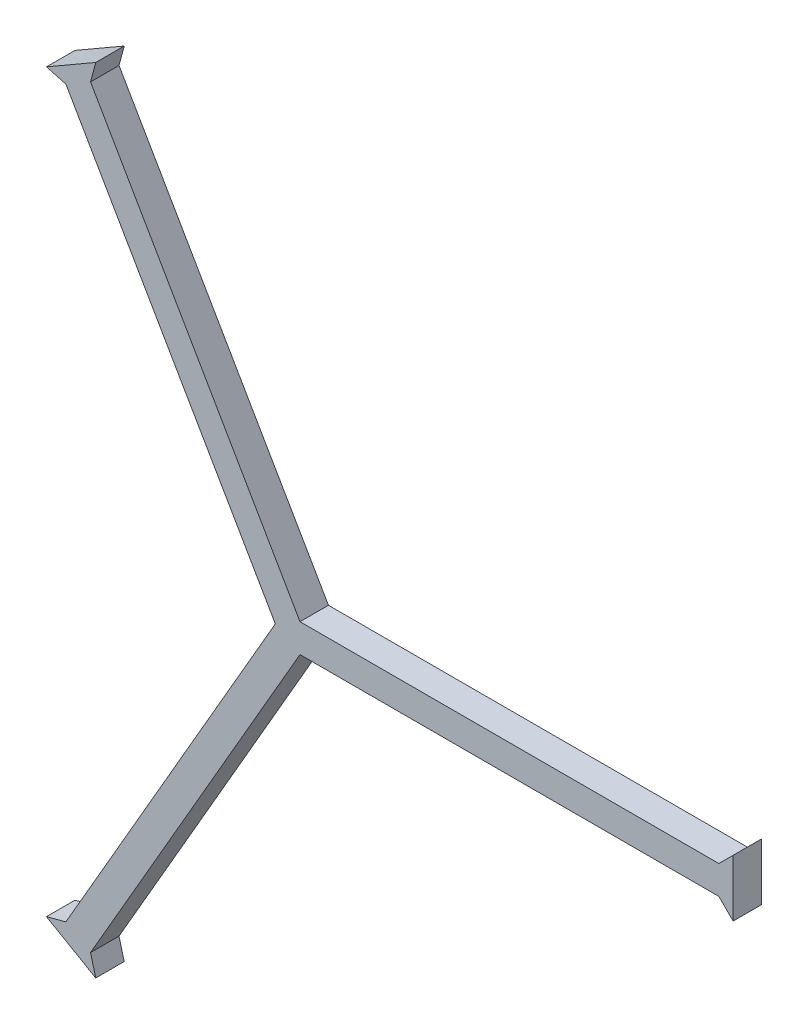
ISO-10303-21;
HEADER;
FILE_DESCRIPTION(('STEP AP214'),'2;1');
FILE_NAME('part.step','',(''),(''),'','','');
FILE_SCHEMA(('AUTOMOTIVE_DESIGN { 1 0 10303 214 1 1 1 1 }'));
ENDSEC;
DATA;
#1=APPLICATION_CONTEXT('core data for automotive mechanical design processes');
#2=APPLICATION_PROTOCOL_DEFINITION('international standard','automotive_design',2000,#1);
#3=PRODUCT_CONTEXT('',#1,'mechanical');
#4=PRODUCT('Part','Part','',(#3));
#5=PRODUCT_RELATED_PRODUCT_CATEGORY('part','',(#4));
#6=PRODUCT_DEFINITION_FORMATION('','',#4);
#7=PRODUCT_DEFINITION_CONTEXT('part definition',#1,'design');
#8=PRODUCT_DEFINITION('design','',#6,#7);
#9=PRODUCT_DEFINITION_SHAPE('','',#8);
#10=(LENGTH_UNIT() NAMED_UNIT(*) SI_UNIT(.MILLI.,.METRE.));
#11=(NAMED_UNIT(*) PLANE_ANGLE_UNIT() SI_UNIT($,.RADIAN.));
#12=(NAMED_UNIT(*) SI_UNIT($,.STERADIAN.) SOLID_ANGLE_UNIT());
#13=UNCERTAINTY_MEASURE_WITH_UNIT(LENGTH_MEASURE(1.E-05),#10,'distance_accuracy_value','');
#14=(GEOMETRIC_REPRESENTATION_CONTEXT(3) GLOBAL_UNCERTAINTY_ASSIGNED_CONTEXT((#13)) GLOBAL_UNIT_ASSIGNED_CONTEXT((#10,
#11,#12)) REPRESENTATION_CONTEXT('',''));
#15=CARTESIAN_POINT('',(0.,0.,0.));
#16=DIRECTION('',(0.,0.,1.));
#17=DIRECTION('',(1.,0.,0.));
#18=AXIS2_PLACEMENT_3D('',#15,#16,#17);
#19=CARTESIAN_POINT('',(150.,5.,10.));
#20=DIRECTION('',(0.,-1.,0.));
#21=DIRECTION('',(1.,0.,0.));
#22=AXIS2_PLACEMENT_3D('',#19,#20,#21);
#23=PLANE('',#22);
#24=DIRECTION('',(0.,0.,-1.));
#25=VECTOR('',#24,1.);
#26=CARTESIAN_POINT('',(2.88675134594807,4.99999999999998,10.));
#27=LINE('',#26,#25);
#28=CARTESIAN_POINT('',(2.88675134594814,4.99999999999998,10.));
#29=VERTEX_POINT('',#28);
#30=CARTESIAN_POINT('',(2.88675134594814,4.99999999999998,0.));
#31=VERTEX_POINT('',#30);
#32=EDGE_CURVE('E48',#29,#31,#27,.T.);
#33=ORIENTED_EDGE('',*,*,#32,.F.);
#34=DIRECTION('',(-1.,0.,0.));
#35=VECTOR('',#34,1.);
#36=CARTESIAN_POINT('',(150.,5.,10.));
#37=LINE('',#36,#35);
#38=CARTESIAN_POINT('',(150.,5.,10.));
#39=VERTEX_POINT('',#38);
#40=EDGE_CURVE('E220',#39,#29,#37,.T.);
#41=ORIENTED_EDGE('',*,*,#40,.F.);
#42=DIRECTION('',(0.,0.,-1.));
#43=VECTOR('',#42,1.);
#44=CARTESIAN_POINT('',(150.,5.,10.));
#45=LINE('',#44,#43);
#46=CARTESIAN_POINT('',(150.,5.,0.));
#47=VERTEX_POINT('',#46);
#48=EDGE_CURVE('E41',#39,#47,#45,.T.);
#49=ORIENTED_EDGE('',*,*,#48,.T.);
#50=DIRECTION('',(-1.,0.,0.));
#51=VECTOR('',#50,1.);
#52=CARTESIAN_POINT('',(150.,5.,0.));
#53=LINE('',#52,#51);
#54=EDGE_CURVE('E53',#47,#31,#53,.T.);
#55=ORIENTED_EDGE('',*,*,#54,.T.);
#56=EDGE_LOOP('',(#33,#41,#49,#55));
#57=FACE_BOUND('',#56,.T.);
#58=ADVANCED_FACE('F33',(#57),#23,.F.);
#59=CARTESIAN_POINT('',(150.,-5.,10.));
#60=DIRECTION('',(0.,1.,0.));
#61=DIRECTION('',(-1.,0.,0.));
#62=AXIS2_PLACEMENT_3D('',#59,#60,#61);
#63=PLANE('',#62);
#64=DIRECTION('',(0.,0.,1.));
#65=VECTOR('',#64,1.);
#66=CARTESIAN_POINT('',(2.88675134594815,-4.99999999999998,10.));
#67=LINE('',#66,#65);
#68=CARTESIAN_POINT('',(2.88675134594815,-4.99999999999998,0.));
#69=VERTEX_POINT('',#68);
#70=CARTESIAN_POINT('',(2.88675134594814,-4.99999999999998,10.));
#71=VERTEX_POINT('',#70);
#72=EDGE_CURVE('E209',#69,#71,#67,.T.);
#73=ORIENTED_EDGE('',*,*,#72,.F.);
#74=DIRECTION('',(1.,0.,0.));
#75=VECTOR('',#74,1.);
#76=CARTESIAN_POINT('',(150.,-5.,0.));
#77=LINE('',#76,#75);
#78=CARTESIAN_POINT('',(150.,-5.,0.));
#79=VERTEX_POINT('',#78);
#80=EDGE_CURVE('E232',#69,#79,#77,.T.);
#81=ORIENTED_EDGE('',*,*,#80,.T.);
#82=DIRECTION('',(0.,0.,-1.));
#83=VECTOR('',#82,1.);
#84=CARTESIAN_POINT('',(150.,-5.,10.));
#85=LINE('',#84,#83);
#86=CARTESIAN_POINT('',(150.,-5.,10.));
#87=VERTEX_POINT('',#86);
#88=EDGE_CURVE('E237',#87,#79,#85,.T.);
#89=ORIENTED_EDGE('',*,*,#88,.F.);
#90=DIRECTION('',(1.,0.,0.));
#91=VECTOR('',#90,1.);
#92=CARTESIAN_POINT('',(150.,-5.,10.));
#93=LINE('',#92,#91);
#94=EDGE_CURVE('E222',#71,#87,#93,.T.);
#95=ORIENTED_EDGE('',*,*,#94,.F.);
#96=EDGE_LOOP('',(#73,#81,#89,#95));
#97=FACE_BOUND('',#96,.T.);
#98=ADVANCED_FACE('F271',(#97),#63,.F.);
#99=CARTESIAN_POINT('',(155.,10.,10.));
#100=DIRECTION('',(-1.,0.,0.));
#101=DIRECTION('',(0.,0.,1.));
#102=AXIS2_PLACEMENT_3D('',#99,#100,#101);
#103=PLANE('',#102);
#104=DIRECTION('',(0.,1.,0.));
#105=VECTOR('',#104,1.);
#106=CARTESIAN_POINT('',(155.,10.,0.));
#107=LINE('',#106,#105);
#108=CARTESIAN_POINT('',(155.,-10.,0.));
#109=VERTEX_POINT('',#108);
#110=CARTESIAN_POINT('',(155.,10.,0.));
#111=VERTEX_POINT('',#110);
#112=EDGE_CURVE('E213',#109,#111,#107,.T.);
#113=ORIENTED_EDGE('',*,*,#112,.T.);
#114=DIRECTION('',(0.,0.,-1.));
#115=VECTOR('',#114,1.);
#116=CARTESIAN_POINT('',(155.,10.,10.));
#117=LINE('',#116,#115);
#118=CARTESIAN_POINT('',(155.,10.,10.));
#119=VERTEX_POINT('',#118);
#120=EDGE_CURVE('E11',#119,#111,#117,.T.);
#121=ORIENTED_EDGE('',*,*,#120,.F.);
#122=DIRECTION('',(0.,1.,0.));
#123=VECTOR('',#122,1.);
#124=CARTESIAN_POINT('',(155.,10.,10.));
#125=LINE('',#124,#123);
#126=CARTESIAN_POINT('',(155.,-10.,10.));
#127=VERTEX_POINT('',#126);
#128=EDGE_CURVE('E214',#127,#119,#125,.T.);
#129=ORIENTED_EDGE('',*,*,#128,.F.);
#130=DIRECTION('',(0.,0.,-1.));
#131=VECTOR('',#130,1.);
#132=CARTESIAN_POINT('',(155.,-10.,10.));
#133=LINE('',#132,#131);
#134=EDGE_CURVE('E226',#127,#109,#133,.T.);
#135=ORIENTED_EDGE('',*,*,#134,.T.);
#136=EDGE_LOOP('',(#113,#121,#129,#135));
#137=FACE_BOUND('',#136,.T.);
#138=ADVANCED_FACE('F35',(#137),#103,.F.);
#139=CARTESIAN_POINT('',(155.,10.,10.));
#140=DIRECTION('',(0.707106781186547,-0.707106781186548,0.));
#141=DIRECTION('',(0.707106781186548,0.707106781186547,0.));
#142=AXIS2_PLACEMENT_3D('',#139,#140,#141);
#143=PLANE('',#142);
#144=DIRECTION('',(-0.707106781186548,-0.707106781186547,0.));
#145=VECTOR('',#144,1.);
#146=CARTESIAN_POINT('',(155.,10.,0.));
#147=LINE('',#146,#145);
#148=EDGE_CURVE('E229',#111,#47,#147,.T.);
#149=ORIENTED_EDGE('',*,*,#148,.T.);
#150=ORIENTED_EDGE('',*,*,#48,.F.);
#151=DIRECTION('',(-0.707106781186548,-0.707106781186547,0.));
#152=VECTOR('',#151,1.);
#153=CARTESIAN_POINT('',(155.,10.,10.));
#154=LINE('',#153,#152);
#155=EDGE_CURVE('E217',#119,#39,#154,.T.);
#156=ORIENTED_EDGE('',*,*,#155,.F.);
#157=ORIENTED_EDGE('',*,*,#120,.T.);
#158=EDGE_LOOP('',(#149,#150,#156,#157));
#159=FACE_BOUND('',#158,.T.);
#160=ADVANCED_FACE('F259',(#159),#143,.F.);
#161=CARTESIAN_POINT('',(155.,-10.,10.));
#162=DIRECTION('',(0.707106781186547,0.707106781186548,0.));
#163=DIRECTION('',(-0.707106781186548,0.707106781186547,0.));
#164=AXIS2_PLACEMENT_3D('',#161,#162,#163);
#165=PLANE('',#164);
#166=DIRECTION('',(0.707106781186548,-0.707106781186547,0.));
#167=VECTOR('',#166,1.);
#168=CARTESIAN_POINT('',(155.,-10.,0.));
#169=LINE('',#168,#167);
#170=EDGE_CURVE('E218',#79,#109,#169,.T.);
#171=ORIENTED_EDGE('',*,*,#170,.T.);
#172=ORIENTED_EDGE('',*,*,#134,.F.);
#173=DIRECTION('',(0.707106781186548,-0.707106781186547,0.));
#174=VECTOR('',#173,1.);
#175=CARTESIAN_POINT('',(155.,-10.,10.));
#176=LINE('',#175,#174);
#177=EDGE_CURVE('E224',#87,#127,#176,.T.);
#178=ORIENTED_EDGE('',*,*,#177,.F.);
#179=ORIENTED_EDGE('',*,*,#88,.T.);
#180=EDGE_LOOP('',(#171,#172,#178,#179));
#181=FACE_BOUND('',#180,.T.);
#182=ADVANCED_FACE('F267',(#181),#165,.F.);
#183=CARTESIAN_POINT('',(0.,0.,10.));
#184=DIRECTION('',(0.,0.,-1.));
#185=DIRECTION('',(-1.,0.,0.));
#186=AXIS2_PLACEMENT_3D('',#183,#184,#185);
#187=PLANE('',#186);
#188=ORIENTED_EDGE('',*,*,#40,.T.);
#189=DIRECTION('',(-0.500000000000004,0.866025403784437,0.));
#190=VECTOR('',#189,1.);
#191=CARTESIAN_POINT('',(-70.6698729810784,132.403810567666,10.));
#192=LINE('',#191,#190);
#193=CARTESIAN_POINT('',(-70.6698729810784,132.403810567666,10.));
#194=VERTEX_POINT('',#193);
#195=EDGE_CURVE('E184',#29,#194,#192,.T.);
#196=ORIENTED_EDGE('',*,*,#195,.T.);
#197=DIRECTION('',(0.258819045102516,0.96592582628907,0.));
#198=VECTOR('',#197,1.);
#199=CARTESIAN_POINT('',(-68.8397459621563,139.233937586588,10.));
#200=LINE('',#199,#198);
#201=CARTESIAN_POINT('',(-68.8397459621563,139.233937586588,10.));
#202=VERTEX_POINT('',#201);
#203=EDGE_CURVE('E186',#194,#202,#200,.T.);
#204=ORIENTED_EDGE('',*,*,#203,.T.);
#205=DIRECTION('',(-0.866025403784436,-0.500000000000004,0.));
#206=VECTOR('',#205,1.);
#207=CARTESIAN_POINT('',(-86.160254037845,129.233937586588,10.));
#208=LINE('',#207,#206);
#209=CARTESIAN_POINT('',(-86.160254037845,129.233937586588,10.));
#210=VERTEX_POINT('',#209);
#211=EDGE_CURVE('E175',#202,#210,#208,.T.);
#212=ORIENTED_EDGE('',*,*,#211,.T.);
#213=DIRECTION('',(0.96592582628907,-0.258819045102517,0.));
#214=VECTOR('',#213,1.);
#215=CARTESIAN_POINT('',(-86.160254037845,129.233937586588,10.));
#216=LINE('',#215,#214);
#217=CARTESIAN_POINT('',(-79.3301270189228,127.403810567665,10.));
#218=VERTEX_POINT('',#217);
#219=EDGE_CURVE('E178',#210,#218,#216,.T.);
#220=ORIENTED_EDGE('',*,*,#219,.T.);
#221=DIRECTION('',(0.500000000000004,-0.866025403784436,0.));
#222=VECTOR('',#221,1.);
#223=CARTESIAN_POINT('',(-79.3301270189228,127.403810567665,10.));
#224=LINE('',#223,#222);
#225=CARTESIAN_POINT('',(-5.77350269189622,0.,10.));
#226=VERTEX_POINT('',#225);
#227=EDGE_CURVE('E181',#218,#226,#224,.T.);
#228=ORIENTED_EDGE('',*,*,#227,.T.);
#229=DIRECTION('',(-0.499999999999992,-0.866025403784443,0.));
#230=VECTOR('',#229,1.);
#231=CARTESIAN_POINT('',(-79.330127018921,-127.403810567666,10.));
#232=LINE('',#231,#230);
#233=CARTESIAN_POINT('',(-79.330127018921,-127.403810567666,10.));
#234=VERTEX_POINT('',#233);
#235=EDGE_CURVE('E275',#226,#234,#232,.T.);
#236=ORIENTED_EDGE('',*,*,#235,.T.);
#237=DIRECTION('',(-0.965925826289066,-0.25881904510253,0.));
#238=VECTOR('',#237,1.);
#239=CARTESIAN_POINT('',(-86.1602540378432,-129.233937586589,10.));
#240=LINE('',#239,#238);
#241=CARTESIAN_POINT('',(-86.1602540378432,-129.233937586589,10.));
#242=VERTEX_POINT('',#241);
#243=EDGE_CURVE('E157',#234,#242,#240,.T.);
#244=ORIENTED_EDGE('',*,*,#243,.T.);
#245=DIRECTION('',(0.866025403784443,-0.499999999999992,0.));
#246=VECTOR('',#245,1.);
#247=CARTESIAN_POINT('',(-68.8397459621543,-139.233937586589,10.));
#248=LINE('',#247,#246);
#249=CARTESIAN_POINT('',(-68.8397459621543,-139.233937586589,10.));
#250=VERTEX_POINT('',#249);
#251=EDGE_CURVE('E152',#242,#250,#248,.T.);
#252=ORIENTED_EDGE('',*,*,#251,.T.);
#253=DIRECTION('',(-0.258819045102529,0.965925826289066,0.));
#254=VECTOR('',#253,1.);
#255=CARTESIAN_POINT('',(-68.8397459621543,-139.233937586589,10.));
#256=LINE('',#255,#254);
#257=CARTESIAN_POINT('',(-70.6698729810766,-132.403810567666,10.));
#258=VERTEX_POINT('',#257);
#259=EDGE_CURVE('E140',#250,#258,#256,.T.);
#260=ORIENTED_EDGE('',*,*,#259,.T.);
#261=DIRECTION('',(0.499999999999992,0.866025403784443,0.));
#262=VECTOR('',#261,1.);
#263=CARTESIAN_POINT('',(-70.6698729810766,-132.403810567666,10.));
#264=LINE('',#263,#262);
#265=EDGE_CURVE('E151',#258,#71,#264,.T.);
#266=ORIENTED_EDGE('',*,*,#265,.T.);
#267=ORIENTED_EDGE('',*,*,#94,.T.);
#268=ORIENTED_EDGE('',*,*,#177,.T.);
#269=ORIENTED_EDGE('',*,*,#128,.T.);
#270=ORIENTED_EDGE('',*,*,#155,.T.);
#271=EDGE_LOOP('',(#188,#196,#204,#212,#220,#228,#236,#244,#252,#260,#266,#267,#268,#269,#270));
#272=FACE_BOUND('',#271,.T.);
#273=ADVANCED_FACE('F155',(#272),#187,.F.);
#274=CARTESIAN_POINT('',(0.,0.,0.));
#275=DIRECTION('',(0.,0.,-1.));
#276=DIRECTION('',(-1.,0.,0.));
#277=AXIS2_PLACEMENT_3D('',#274,#275,#276);
#278=PLANE('',#277);
#279=DIRECTION('',(-0.500000000000004,0.866025403784437,0.));
#280=VECTOR('',#279,1.);
#281=CARTESIAN_POINT('',(-70.6698729810784,132.403810567666,0.));
#282=LINE('',#281,#280);
#283=CARTESIAN_POINT('',(-70.6698729810784,132.403810567666,0.));
#284=VERTEX_POINT('',#283);
#285=EDGE_CURVE('E195',#31,#284,#282,.T.);
#286=ORIENTED_EDGE('',*,*,#285,.F.);
#287=ORIENTED_EDGE('',*,*,#54,.F.);
#288=ORIENTED_EDGE('',*,*,#148,.F.);
#289=ORIENTED_EDGE('',*,*,#112,.F.);
#290=ORIENTED_EDGE('',*,*,#170,.F.);
#291=ORIENTED_EDGE('',*,*,#80,.F.);
#292=DIRECTION('',(0.499999999999992,0.866025403784443,0.));
#293=VECTOR('',#292,1.);
#294=CARTESIAN_POINT('',(-70.6698729810766,-132.403810567666,0.));
#295=LINE('',#294,#293);
#296=CARTESIAN_POINT('',(-70.6698729810766,-132.403810567666,0.));
#297=VERTEX_POINT('',#296);
#298=EDGE_CURVE('E274',#297,#69,#295,.T.);
#299=ORIENTED_EDGE('',*,*,#298,.F.);
#300=DIRECTION('',(-0.258819045102529,0.965925826289066,0.));
#301=VECTOR('',#300,1.);
#302=CARTESIAN_POINT('',(-68.8397459621543,-139.233937586589,0.));
#303=LINE('',#302,#301);
#304=CARTESIAN_POINT('',(-68.8397459621543,-139.233937586589,0.));
#305=VERTEX_POINT('',#304);
#306=EDGE_CURVE('E282',#305,#297,#303,.T.);
#307=ORIENTED_EDGE('',*,*,#306,.F.);
#308=DIRECTION('',(0.866025403784443,-0.499999999999992,0.));
#309=VECTOR('',#308,1.);
#310=CARTESIAN_POINT('',(-68.8397459621543,-139.233937586589,0.));
#311=LINE('',#310,#309);
#312=CARTESIAN_POINT('',(-86.1602540378432,-129.233937586589,0.));
#313=VERTEX_POINT('',#312);
#314=EDGE_CURVE('E165',#313,#305,#311,.T.);
#315=ORIENTED_EDGE('',*,*,#314,.F.);
#316=DIRECTION('',(-0.965925826289066,-0.25881904510253,0.));
#317=VECTOR('',#316,1.);
#318=CARTESIAN_POINT('',(-86.1602540378432,-129.233937586589,0.));
#319=LINE('',#318,#317);
#320=CARTESIAN_POINT('',(-79.330127018921,-127.403810567666,0.));
#321=VERTEX_POINT('',#320);
#322=EDGE_CURVE('E161',#321,#313,#319,.T.);
#323=ORIENTED_EDGE('',*,*,#322,.F.);
#324=DIRECTION('',(-0.499999999999992,-0.866025403784443,0.));
#325=VECTOR('',#324,1.);
#326=CARTESIAN_POINT('',(-79.330127018921,-127.403810567666,0.));
#327=LINE('',#326,#325);
#328=CARTESIAN_POINT('',(-5.77350269189622,0.,0.));
#329=VERTEX_POINT('',#328);
#330=EDGE_CURVE('E285',#329,#321,#327,.T.);
#331=ORIENTED_EDGE('',*,*,#330,.F.);
#332=DIRECTION('',(0.500000000000004,-0.866025403784436,0.));
#333=VECTOR('',#332,1.);
#334=CARTESIAN_POINT('',(-79.3301270189228,127.403810567665,0.));
#335=LINE('',#334,#333);
#336=CARTESIAN_POINT('',(-79.3301270189228,127.403810567665,0.));
#337=VERTEX_POINT('',#336);
#338=EDGE_CURVE('E193',#337,#329,#335,.T.);
#339=ORIENTED_EDGE('',*,*,#338,.F.);
#340=DIRECTION('',(0.96592582628907,-0.258819045102517,0.));
#341=VECTOR('',#340,1.);
#342=CARTESIAN_POINT('',(-86.160254037845,129.233937586588,0.));
#343=LINE('',#342,#341);
#344=CARTESIAN_POINT('',(-86.160254037845,129.233937586588,0.));
#345=VERTEX_POINT('',#344);
#346=EDGE_CURVE('E191',#345,#337,#343,.T.);
#347=ORIENTED_EDGE('',*,*,#346,.F.);
#348=DIRECTION('',(-0.866025403784436,-0.500000000000004,0.));
#349=VECTOR('',#348,1.);
#350=CARTESIAN_POINT('',(-86.160254037845,129.233937586588,0.));
#351=LINE('',#350,#349);
#352=CARTESIAN_POINT('',(-68.8397459621563,139.233937586588,0.));
#353=VERTEX_POINT('',#352);
#354=EDGE_CURVE('E169',#353,#345,#351,.T.);
#355=ORIENTED_EDGE('',*,*,#354,.F.);
#356=DIRECTION('',(0.258819045102516,0.96592582628907,0.));
#357=VECTOR('',#356,1.);
#358=CARTESIAN_POINT('',(-68.8397459621563,139.233937586588,0.));
#359=LINE('',#358,#357);
#360=EDGE_CURVE('E179',#284,#353,#359,.T.);
#361=ORIENTED_EDGE('',*,*,#360,.F.);
#362=EDGE_LOOP('',(#286,#287,#288,#289,#290,#291,#299,#307,#315,#323,#331,#339,#347,#355,#361));
#363=FACE_BOUND('',#362,.T.);
#364=ADVANCED_FACE('F243',(#363),#278,.T.);
#365=CARTESIAN_POINT('',(-70.6698729810784,132.403810567666,10.));
#366=DIRECTION('',(-0.866025403784436,-0.500000000000004,0.));
#367=DIRECTION('',(0.500000000000004,-0.866025403784436,0.));
#368=AXIS2_PLACEMENT_3D('',#365,#366,#367);
#369=PLANE('',#368);
#370=ORIENTED_EDGE('',*,*,#195,.F.);
#371=ORIENTED_EDGE('',*,*,#32,.T.);
#372=ORIENTED_EDGE('',*,*,#285,.T.);
#373=DIRECTION('',(0.,0.,-1.));
#374=VECTOR('',#373,1.);
#375=CARTESIAN_POINT('',(-70.6698729810784,132.403810567666,10.));
#376=LINE('',#375,#374);
#377=EDGE_CURVE('E200',#194,#284,#376,.T.);
#378=ORIENTED_EDGE('',*,*,#377,.F.);
#379=EDGE_LOOP('',(#370,#371,#372,#378));
#380=FACE_BOUND('',#379,.T.);
#381=ADVANCED_FACE('F250',(#380),#369,.F.);
#382=CARTESIAN_POINT('',(-70.6698729810766,-132.403810567666,10.));
#383=DIRECTION('',(-0.866025403784443,0.499999999999992,0.));
#384=DIRECTION('',(-0.499999999999992,-0.866025403784443,0.));
#385=AXIS2_PLACEMENT_3D('',#382,#383,#384);
#386=PLANE('',#385);
#387=ORIENTED_EDGE('',*,*,#298,.T.);
#388=ORIENTED_EDGE('',*,*,#72,.T.);
#389=ORIENTED_EDGE('',*,*,#265,.F.);
#390=DIRECTION('',(0.,0.,-1.));
#391=VECTOR('',#390,1.);
#392=CARTESIAN_POINT('',(-70.6698729810766,-132.403810567666,10.));
#393=LINE('',#392,#391);
#394=EDGE_CURVE('E147',#258,#297,#393,.T.);
#395=ORIENTED_EDGE('',*,*,#394,.T.);
#396=EDGE_LOOP('',(#387,#388,#389,#395));
#397=FACE_BOUND('',#396,.T.);
#398=ADVANCED_FACE('F273',(#397),#386,.F.);
#399=CARTESIAN_POINT('',(-79.3301270189228,127.403810567665,10.));
#400=DIRECTION('',(0.866025403784436,0.500000000000004,0.));
#401=DIRECTION('',(-0.500000000000004,0.866025403784436,0.));
#402=AXIS2_PLACEMENT_3D('',#399,#400,#401);
#403=PLANE('',#402);
#404=DIRECTION('',(0.,0.,-1.));
#405=VECTOR('',#404,1.);
#406=CARTESIAN_POINT('',(-5.77350269189621,0.,10.));
#407=LINE('',#406,#405);
#408=EDGE_CURVE('E166',#226,#329,#407,.T.);
#409=ORIENTED_EDGE('',*,*,#408,.F.);
#410=ORIENTED_EDGE('',*,*,#227,.F.);
#411=DIRECTION('',(0.,0.,-1.));
#412=VECTOR('',#411,1.);
#413=CARTESIAN_POINT('',(-79.3301270189228,127.403810567665,10.));
#414=LINE('',#413,#412);
#415=EDGE_CURVE('E203',#218,#337,#414,.T.);
#416=ORIENTED_EDGE('',*,*,#415,.T.);
#417=ORIENTED_EDGE('',*,*,#338,.T.);
#418=EDGE_LOOP('',(#409,#410,#416,#417));
#419=FACE_BOUND('',#418,.T.);
#420=ADVANCED_FACE('F300',(#419),#403,.F.);
#421=CARTESIAN_POINT('',(-86.160254037845,129.233937586588,10.));
#422=DIRECTION('',(0.500000000000004,-0.866025403784436,0.));
#423=DIRECTION('',(0.866025403784436,0.500000000000004,0.));
#424=AXIS2_PLACEMENT_3D('',#421,#422,#423);
#425=PLANE('',#424);
#426=ORIENTED_EDGE('',*,*,#354,.T.);
#427=DIRECTION('',(0.,0.,-1.));
#428=VECTOR('',#427,1.);
#429=CARTESIAN_POINT('',(-86.160254037845,129.233937586588,10.));
#430=LINE('',#429,#428);
#431=EDGE_CURVE('E206',#210,#345,#430,.T.);
#432=ORIENTED_EDGE('',*,*,#431,.F.);
#433=ORIENTED_EDGE('',*,*,#211,.F.);
#434=DIRECTION('',(0.,0.,-1.));
#435=VECTOR('',#434,1.);
#436=CARTESIAN_POINT('',(-68.8397459621563,139.233937586588,10.));
#437=LINE('',#436,#435);
#438=EDGE_CURVE('E188',#202,#353,#437,.T.);
#439=ORIENTED_EDGE('',*,*,#438,.T.);
#440=EDGE_LOOP('',(#426,#432,#433,#439));
#441=FACE_BOUND('',#440,.T.);
#442=ADVANCED_FACE('F305',(#441),#425,.F.);
#443=CARTESIAN_POINT('',(-86.160254037845,129.233937586588,10.));
#444=DIRECTION('',(0.258819045102517,0.965925826289069,0.));
#445=DIRECTION('',(-0.965925826289069,0.258819045102517,0.));
#446=AXIS2_PLACEMENT_3D('',#443,#444,#445);
#447=PLANE('',#446);
#448=ORIENTED_EDGE('',*,*,#346,.T.);
#449=ORIENTED_EDGE('',*,*,#415,.F.);
#450=ORIENTED_EDGE('',*,*,#219,.F.);
#451=ORIENTED_EDGE('',*,*,#431,.T.);
#452=EDGE_LOOP('',(#448,#449,#450,#451));
#453=FACE_BOUND('',#452,.T.);
#454=ADVANCED_FACE('F303',(#453),#447,.F.);
#455=CARTESIAN_POINT('',(-68.8397459621563,139.233937586588,10.));
#456=DIRECTION('',(-0.96592582628907,0.258819045102516,0.));
#457=DIRECTION('',(-0.258819045102516,-0.96592582628907,0.));
#458=AXIS2_PLACEMENT_3D('',#455,#456,#457);
#459=PLANE('',#458);
#460=ORIENTED_EDGE('',*,*,#360,.T.);
#461=ORIENTED_EDGE('',*,*,#438,.F.);
#462=ORIENTED_EDGE('',*,*,#203,.F.);
#463=ORIENTED_EDGE('',*,*,#377,.T.);
#464=EDGE_LOOP('',(#460,#461,#462,#463));
#465=FACE_BOUND('',#464,.T.);
#466=ADVANCED_FACE('F253',(#465),#459,.F.);
#467=CARTESIAN_POINT('',(-79.330127018921,-127.403810567666,10.));
#468=DIRECTION('',(0.866025403784443,-0.499999999999992,0.));
#469=DIRECTION('',(0.499999999999992,0.866025403784443,0.));
#470=AXIS2_PLACEMENT_3D('',#467,#468,#469);
#471=PLANE('',#470);
#472=ORIENTED_EDGE('',*,*,#235,.F.);
#473=ORIENTED_EDGE('',*,*,#408,.T.);
#474=ORIENTED_EDGE('',*,*,#330,.T.);
#475=DIRECTION('',(0.,0.,-1.));
#476=VECTOR('',#475,1.);
#477=CARTESIAN_POINT('',(-79.330127018921,-127.403810567666,10.));
#478=LINE('',#477,#476);
#479=EDGE_CURVE('E171',#234,#321,#478,.T.);
#480=ORIENTED_EDGE('',*,*,#479,.F.);
#481=EDGE_LOOP('',(#472,#473,#474,#480));
#482=FACE_BOUND('',#481,.T.);
#483=ADVANCED_FACE('F297',(#482),#471,.F.);
#484=CARTESIAN_POINT('',(-68.8397459621543,-139.233937586589,10.));
#485=DIRECTION('',(0.499999999999992,0.866025403784443,0.));
#486=DIRECTION('',(-0.866025403784443,0.499999999999992,0.));
#487=AXIS2_PLACEMENT_3D('',#484,#485,#486);
#488=PLANE('',#487);
#489=ORIENTED_EDGE('',*,*,#314,.T.);
#490=DIRECTION('',(0.,0.,-1.));
#491=VECTOR('',#490,1.);
#492=CARTESIAN_POINT('',(-68.8397459621543,-139.233937586589,10.));
#493=LINE('',#492,#491);
#494=EDGE_CURVE('E144',#250,#305,#493,.T.);
#495=ORIENTED_EDGE('',*,*,#494,.F.);
#496=ORIENTED_EDGE('',*,*,#251,.F.);
#497=DIRECTION('',(0.,0.,-1.));
#498=VECTOR('',#497,1.);
#499=CARTESIAN_POINT('',(-86.1602540378432,-129.233937586589,10.));
#500=LINE('',#499,#498);
#501=EDGE_CURVE('E280',#242,#313,#500,.T.);
#502=ORIENTED_EDGE('',*,*,#501,.T.);
#503=EDGE_LOOP('',(#489,#495,#496,#502));
#504=FACE_BOUND('',#503,.T.);
#505=ADVANCED_FACE('F163',(#504),#488,.F.);
#506=CARTESIAN_POINT('',(-68.8397459621543,-139.233937586589,10.));
#507=DIRECTION('',(-0.965925826289066,-0.258819045102529,0.));
#508=DIRECTION('',(0.258819045102529,-0.965925826289066,0.));
#509=AXIS2_PLACEMENT_3D('',#506,#507,#508);
#510=PLANE('',#509);
#511=ORIENTED_EDGE('',*,*,#306,.T.);
#512=ORIENTED_EDGE('',*,*,#394,.F.);
#513=ORIENTED_EDGE('',*,*,#259,.F.);
#514=ORIENTED_EDGE('',*,*,#494,.T.);
#515=EDGE_LOOP('',(#511,#512,#513,#514));
#516=FACE_BOUND('',#515,.T.);
#517=ADVANCED_FACE('F142',(#516),#510,.F.);
#518=CARTESIAN_POINT('',(-86.1602540378432,-129.233937586589,10.));
#519=DIRECTION('',(0.258819045102531,-0.965925826289066,0.));
#520=DIRECTION('',(0.965925826289066,0.258819045102531,0.));
#521=AXIS2_PLACEMENT_3D('',#518,#519,#520);
#522=PLANE('',#521);
#523=ORIENTED_EDGE('',*,*,#322,.T.);
#524=ORIENTED_EDGE('',*,*,#501,.F.);
#525=ORIENTED_EDGE('',*,*,#243,.F.);
#526=ORIENTED_EDGE('',*,*,#479,.T.);
#527=EDGE_LOOP('',(#523,#524,#525,#526));
#528=FACE_BOUND('',#527,.T.);
#529=ADVANCED_FACE('F292',(#528),#522,.F.);
#530=CLOSED_SHELL('',(#58,#98,#138,#160,#182,#273,#364,#381,#398,#420,#442,#454,#466,#483,#505,
#517,#529));
#531=MANIFOLD_SOLID_BREP('B2',#530);
#532=ADVANCED_BREP_SHAPE_REPRESENTATION('',(#18,#531),#14);
#533=SHAPE_DEFINITION_REPRESENTATION(#9,#532);
ENDSEC;
END-ISO-10303-21;
